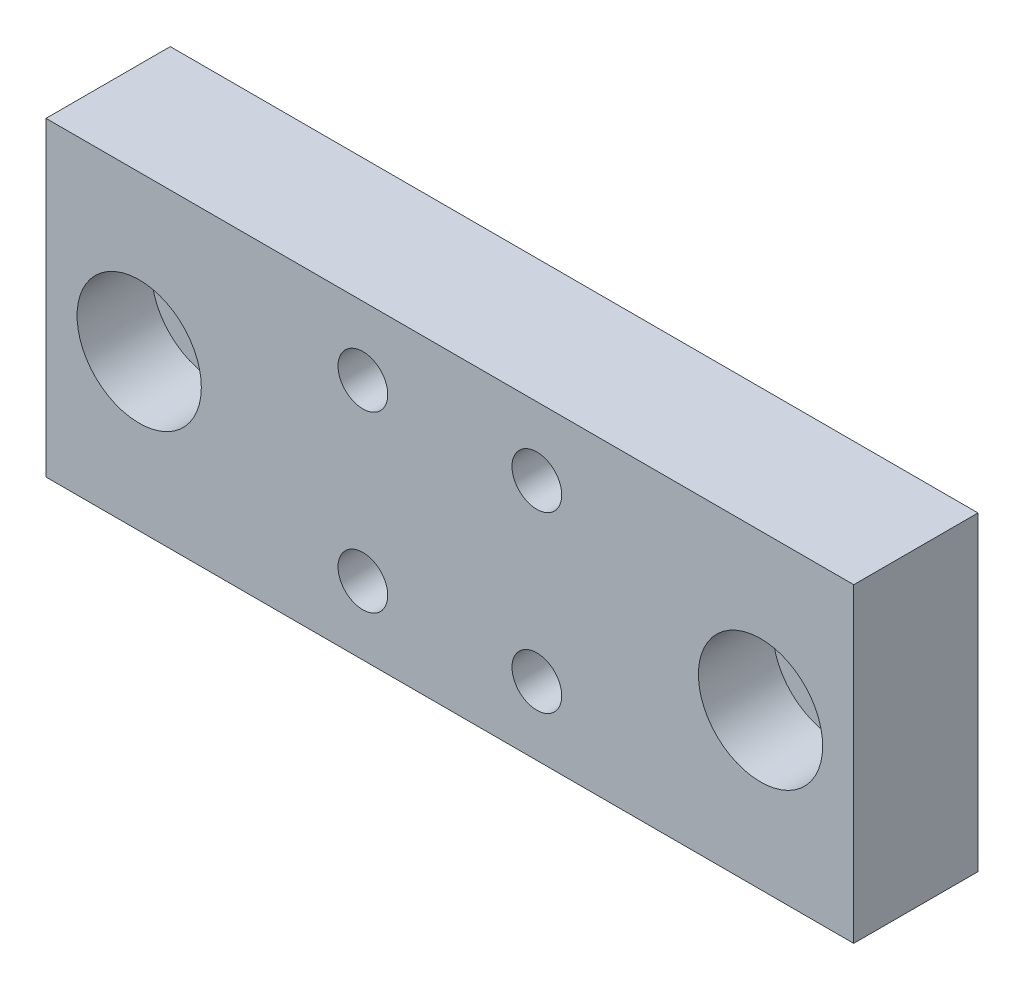
ISO-10303-21;
HEADER;
FILE_DESCRIPTION(('STEP AP214'),'2;1');
FILE_NAME('part.step','',(''),(''),'','','');
FILE_SCHEMA(('AUTOMOTIVE_DESIGN { 1 0 10303 214 1 1 1 1 }'));
ENDSEC;
DATA;
#1=APPLICATION_CONTEXT('core data for automotive mechanical design processes');
#2=APPLICATION_PROTOCOL_DEFINITION('international standard','automotive_design',2000,#1);
#3=PRODUCT_CONTEXT('',#1,'mechanical');
#4=PRODUCT('Part','Part','',(#3));
#5=PRODUCT_RELATED_PRODUCT_CATEGORY('part','',(#4));
#6=PRODUCT_DEFINITION_FORMATION('','',#4);
#7=PRODUCT_DEFINITION_CONTEXT('part definition',#1,'design');
#8=PRODUCT_DEFINITION('design','',#6,#7);
#9=PRODUCT_DEFINITION_SHAPE('','',#8);
#10=(LENGTH_UNIT() NAMED_UNIT(*) SI_UNIT(.MILLI.,.METRE.));
#11=(NAMED_UNIT(*) PLANE_ANGLE_UNIT() SI_UNIT($,.RADIAN.));
#12=(NAMED_UNIT(*) SI_UNIT($,.STERADIAN.) SOLID_ANGLE_UNIT());
#13=UNCERTAINTY_MEASURE_WITH_UNIT(LENGTH_MEASURE(1.E-05),#10,'distance_accuracy_value','');
#14=(GEOMETRIC_REPRESENTATION_CONTEXT(3) GLOBAL_UNCERTAINTY_ASSIGNED_CONTEXT((#13)) GLOBAL_UNIT_ASSIGNED_CONTEXT((#10,
#11,#12)) REPRESENTATION_CONTEXT('',''));
#15=CARTESIAN_POINT('',(0.,0.,0.));
#16=DIRECTION('',(0.,0.,1.));
#17=DIRECTION('',(1.,0.,0.));
#18=AXIS2_PLACEMENT_3D('',#15,#16,#17);
#19=CARTESIAN_POINT('',(9.97863247863252,0.,-14.2));
#20=DIRECTION('',(0.,0.,1.));
#21=DIRECTION('',(1.,0.,0.));
#22=AXIS2_PLACEMENT_3D('',#19,#20,#21);
#23=CYLINDRICAL_SURFACE('',#22,3.);
#24=CARTESIAN_POINT('',(9.97863247863252,0.,0.));
#25=DIRECTION('',(0.,0.,-1.));
#26=DIRECTION('',(-1.,0.,0.));
#27=AXIS2_PLACEMENT_3D('',#24,#25,#26);
#28=CIRCLE('',#27,3.);
#29=CARTESIAN_POINT('',(6.97863247863252,0.,0.));
#30=VERTEX_POINT('',#29);
#31=EDGE_CURVE('E143',#30,#30,#28,.T.);
#32=ORIENTED_EDGE('',*,*,#31,.T.);
#33=EDGE_LOOP('',(#32));
#34=FACE_BOUND('',#33,.T.);
#35=CARTESIAN_POINT('',(9.97863247863252,0.,4.));
#36=DIRECTION('',(0.,0.,1.));
#37=DIRECTION('',(1.,0.,0.));
#38=AXIS2_PLACEMENT_3D('',#35,#36,#37);
#39=CIRCLE('',#38,3.);
#40=CARTESIAN_POINT('',(12.9786324786325,0.,4.));
#41=VERTEX_POINT('',#40);
#42=EDGE_CURVE('E51',#41,#41,#39,.F.);
#43=ORIENTED_EDGE('',*,*,#42,.F.);
#44=EDGE_LOOP('',(#43));
#45=FACE_BOUND('',#44,.T.);
#46=ADVANCED_FACE('F47',(#34,#45),#23,.F.);
#47=CARTESIAN_POINT('',(-40.0213675213675,0.,-14.2));
#48=DIRECTION('',(0.,0.,1.));
#49=DIRECTION('',(1.,0.,0.));
#50=AXIS2_PLACEMENT_3D('',#47,#48,#49);
#51=CYLINDRICAL_SURFACE('',#50,3.);
#52=CARTESIAN_POINT('',(-40.0213675213675,0.,0.));
#53=DIRECTION('',(0.,0.,-1.));
#54=DIRECTION('',(-1.,0.,0.));
#55=AXIS2_PLACEMENT_3D('',#52,#53,#54);
#56=CIRCLE('',#55,3.);
#57=CARTESIAN_POINT('',(-43.0213675213675,0.,0.));
#58=VERTEX_POINT('',#57);
#59=EDGE_CURVE('E139',#58,#58,#56,.T.);
#60=ORIENTED_EDGE('',*,*,#59,.T.);
#61=EDGE_LOOP('',(#60));
#62=FACE_BOUND('',#61,.T.);
#63=CARTESIAN_POINT('',(-40.0213675213675,0.,4.));
#64=DIRECTION('',(0.,0.,1.));
#65=DIRECTION('',(1.,0.,0.));
#66=AXIS2_PLACEMENT_3D('',#63,#64,#65);
#67=CIRCLE('',#66,3.);
#68=CARTESIAN_POINT('',(-37.0213675213675,0.,4.));
#69=VERTEX_POINT('',#68);
#70=EDGE_CURVE('E145',#69,#69,#67,.F.);
#71=ORIENTED_EDGE('',*,*,#70,.F.);
#72=EDGE_LOOP('',(#71));
#73=FACE_BOUND('',#72,.T.);
#74=ADVANCED_FACE('F217',(#62,#73),#51,.F.);
#75=CARTESIAN_POINT('',(-22.0213675213675,7.00000000000001,10.));
#76=DIRECTION('',(0.,0.,-1.));
#77=DIRECTION('',(-1.,0.,0.));
#78=AXIS2_PLACEMENT_3D('',#75,#76,#77);
#79=CYLINDRICAL_SURFACE('',#78,2.);
#80=CARTESIAN_POINT('',(-22.0213675213675,7.00000000000001,10.));
#81=DIRECTION('',(0.,0.,-1.));
#82=DIRECTION('',(-1.,0.,0.));
#83=AXIS2_PLACEMENT_3D('',#80,#81,#82);
#84=CIRCLE('',#83,2.);
#85=CARTESIAN_POINT('',(-24.0213675213675,7.00000000000001,10.));
#86=VERTEX_POINT('',#85);
#87=EDGE_CURVE('E126',#86,#86,#84,.T.);
#88=ORIENTED_EDGE('',*,*,#87,.F.);
#89=EDGE_LOOP('',(#88));
#90=FACE_BOUND('',#89,.T.);
#91=CARTESIAN_POINT('',(-22.0213675213675,7.00000000000001,3.7));
#92=DIRECTION('',(0.,0.,-1.));
#93=DIRECTION('',(-1.,0.,0.));
#94=AXIS2_PLACEMENT_3D('',#91,#92,#93);
#95=CIRCLE('',#94,2.);
#96=CARTESIAN_POINT('',(-24.0213675213675,7.00000000000001,3.7));
#97=VERTEX_POINT('',#96);
#98=EDGE_CURVE('E135',#97,#97,#95,.F.);
#99=ORIENTED_EDGE('',*,*,#98,.F.);
#100=EDGE_LOOP('',(#99));
#101=FACE_BOUND('',#100,.T.);
#102=ADVANCED_FACE('F223',(#90,#101),#79,.F.);
#103=CARTESIAN_POINT('',(-8.02136752136748,7.00000000000001,10.));
#104=DIRECTION('',(0.,0.,-1.));
#105=DIRECTION('',(-1.,0.,0.));
#106=AXIS2_PLACEMENT_3D('',#103,#104,#105);
#107=CYLINDRICAL_SURFACE('',#106,2.);
#108=CARTESIAN_POINT('',(-8.02136752136748,7.00000000000001,10.));
#109=DIRECTION('',(0.,0.,-1.));
#110=DIRECTION('',(-1.,0.,0.));
#111=AXIS2_PLACEMENT_3D('',#108,#109,#110);
#112=CIRCLE('',#111,2.);
#113=CARTESIAN_POINT('',(-10.0213675213675,7.00000000000001,10.));
#114=VERTEX_POINT('',#113);
#115=EDGE_CURVE('E184',#114,#114,#112,.T.);
#116=ORIENTED_EDGE('',*,*,#115,.F.);
#117=EDGE_LOOP('',(#116));
#118=FACE_BOUND('',#117,.T.);
#119=CARTESIAN_POINT('',(-8.02136752136748,7.00000000000001,3.7));
#120=DIRECTION('',(0.,0.,-1.));
#121=DIRECTION('',(-1.,0.,0.));
#122=AXIS2_PLACEMENT_3D('',#119,#120,#121);
#123=CIRCLE('',#122,2.);
#124=CARTESIAN_POINT('',(-10.0213675213675,7.00000000000001,3.7));
#125=VERTEX_POINT('',#124);
#126=EDGE_CURVE('E131',#125,#125,#123,.F.);
#127=ORIENTED_EDGE('',*,*,#126,.F.);
#128=EDGE_LOOP('',(#127));
#129=FACE_BOUND('',#128,.T.);
#130=ADVANCED_FACE('F291',(#118,#129),#107,.F.);
#131=CARTESIAN_POINT('',(-8.02136752136748,-6.99999999999999,10.));
#132=DIRECTION('',(0.,0.,-1.));
#133=DIRECTION('',(-1.,0.,0.));
#134=AXIS2_PLACEMENT_3D('',#131,#132,#133);
#135=CYLINDRICAL_SURFACE('',#134,2.);
#136=CARTESIAN_POINT('',(-8.02136752136748,-6.99999999999999,10.));
#137=DIRECTION('',(0.,0.,-1.));
#138=DIRECTION('',(-1.,0.,0.));
#139=AXIS2_PLACEMENT_3D('',#136,#137,#138);
#140=CIRCLE('',#139,2.);
#141=CARTESIAN_POINT('',(-10.0213675213675,-6.99999999999999,10.));
#142=VERTEX_POINT('',#141);
#143=EDGE_CURVE('E181',#142,#142,#140,.T.);
#144=ORIENTED_EDGE('',*,*,#143,.F.);
#145=EDGE_LOOP('',(#144));
#146=FACE_BOUND('',#145,.T.);
#147=CARTESIAN_POINT('',(-8.02136752136748,-6.99999999999999,3.7));
#148=DIRECTION('',(0.,0.,-1.));
#149=DIRECTION('',(-1.,0.,0.));
#150=AXIS2_PLACEMENT_3D('',#147,#148,#149);
#151=CIRCLE('',#150,2.);
#152=CARTESIAN_POINT('',(-10.0213675213675,-6.99999999999999,3.7));
#153=VERTEX_POINT('',#152);
#154=EDGE_CURVE('E128',#153,#153,#151,.F.);
#155=ORIENTED_EDGE('',*,*,#154,.F.);
#156=EDGE_LOOP('',(#155));
#157=FACE_BOUND('',#156,.T.);
#158=ADVANCED_FACE('F196',(#146,#157),#135,.F.);
#159=CARTESIAN_POINT('',(-22.0213675213675,-6.99999999999999,10.));
#160=DIRECTION('',(0.,0.,-1.));
#161=DIRECTION('',(-1.,0.,0.));
#162=AXIS2_PLACEMENT_3D('',#159,#160,#161);
#163=CYLINDRICAL_SURFACE('',#162,2.);
#164=CARTESIAN_POINT('',(-22.0213675213675,-6.99999999999999,10.));
#165=DIRECTION('',(0.,0.,-1.));
#166=DIRECTION('',(-1.,0.,0.));
#167=AXIS2_PLACEMENT_3D('',#164,#165,#166);
#168=CIRCLE('',#167,2.);
#169=CARTESIAN_POINT('',(-24.0213675213675,-6.99999999999999,10.));
#170=VERTEX_POINT('',#169);
#171=EDGE_CURVE('E117',#170,#170,#168,.T.);
#172=ORIENTED_EDGE('',*,*,#171,.F.);
#173=EDGE_LOOP('',(#172));
#174=FACE_BOUND('',#173,.T.);
#175=CARTESIAN_POINT('',(-22.0213675213675,-6.99999999999999,3.7));
#176=DIRECTION('',(0.,0.,-1.));
#177=DIRECTION('',(-1.,0.,0.));
#178=AXIS2_PLACEMENT_3D('',#175,#176,#177);
#179=CIRCLE('',#178,2.);
#180=CARTESIAN_POINT('',(-24.0213675213675,-6.99999999999999,3.7));
#181=VERTEX_POINT('',#180);
#182=EDGE_CURVE('E123',#181,#181,#179,.F.);
#183=ORIENTED_EDGE('',*,*,#182,.F.);
#184=EDGE_LOOP('',(#183));
#185=FACE_BOUND('',#184,.T.);
#186=ADVANCED_FACE('F193',(#174,#185),#163,.F.);
#187=CARTESIAN_POINT('',(17.4786324786325,-12.5,10.));
#188=DIRECTION('',(-1.,0.,0.));
#189=DIRECTION('',(0.,0.,1.));
#190=AXIS2_PLACEMENT_3D('',#187,#188,#189);
#191=PLANE('',#190);
#192=DIRECTION('',(0.,1.,0.));
#193=VECTOR('',#192,1.);
#194=CARTESIAN_POINT('',(17.4786324786325,-12.5,0.));
#195=LINE('',#194,#193);
#196=CARTESIAN_POINT('',(17.4786324786325,-12.5,0.));
#197=VERTEX_POINT('',#196);
#198=CARTESIAN_POINT('',(17.4786324786325,12.5,0.));
#199=VERTEX_POINT('',#198);
#200=EDGE_CURVE('E114',#197,#199,#195,.T.);
#201=ORIENTED_EDGE('',*,*,#200,.T.);
#202=DIRECTION('',(0.,0.,-1.));
#203=VECTOR('',#202,1.);
#204=CARTESIAN_POINT('',(17.4786324786325,12.5,10.));
#205=LINE('',#204,#203);
#206=CARTESIAN_POINT('',(17.4786324786325,12.5,10.));
#207=VERTEX_POINT('',#206);
#208=EDGE_CURVE('E13',#207,#199,#205,.T.);
#209=ORIENTED_EDGE('',*,*,#208,.F.);
#210=DIRECTION('',(0.,1.,0.));
#211=VECTOR('',#210,1.);
#212=CARTESIAN_POINT('',(17.4786324786325,-12.5,10.));
#213=LINE('',#212,#211);
#214=CARTESIAN_POINT('',(17.4786324786325,-12.5,10.));
#215=VERTEX_POINT('',#214);
#216=EDGE_CURVE('E101',#215,#207,#213,.T.);
#217=ORIENTED_EDGE('',*,*,#216,.F.);
#218=DIRECTION('',(0.,0.,-1.));
#219=VECTOR('',#218,1.);
#220=CARTESIAN_POINT('',(17.4786324786325,-12.5,10.));
#221=LINE('',#220,#219);
#222=EDGE_CURVE('E110',#215,#197,#221,.T.);
#223=ORIENTED_EDGE('',*,*,#222,.T.);
#224=EDGE_LOOP('',(#201,#209,#217,#223));
#225=FACE_BOUND('',#224,.T.);
#226=ADVANCED_FACE('F49',(#225),#191,.F.);
#227=CARTESIAN_POINT('',(-47.5213675213675,12.5,10.));
#228=DIRECTION('',(0.,-1.,0.));
#229=DIRECTION('',(0.,0.,-1.));
#230=AXIS2_PLACEMENT_3D('',#227,#228,#229);
#231=PLANE('',#230);
#232=DIRECTION('',(-1.,0.,0.));
#233=VECTOR('',#232,1.);
#234=CARTESIAN_POINT('',(-47.5213675213675,12.5,0.));
#235=LINE('',#234,#233);
#236=CARTESIAN_POINT('',(-47.5213675213675,12.5,0.));
#237=VERTEX_POINT('',#236);
#238=EDGE_CURVE('E105',#199,#237,#235,.T.);
#239=ORIENTED_EDGE('',*,*,#238,.T.);
#240=DIRECTION('',(0.,0.,-1.));
#241=VECTOR('',#240,1.);
#242=CARTESIAN_POINT('',(-47.5213675213675,12.5,10.));
#243=LINE('',#242,#241);
#244=CARTESIAN_POINT('',(-47.5213675213675,12.5,10.));
#245=VERTEX_POINT('',#244);
#246=EDGE_CURVE('E57',#245,#237,#243,.T.);
#247=ORIENTED_EDGE('',*,*,#246,.F.);
#248=DIRECTION('',(-1.,0.,0.));
#249=VECTOR('',#248,1.);
#250=CARTESIAN_POINT('',(-47.5213675213675,12.5,10.));
#251=LINE('',#250,#249);
#252=EDGE_CURVE('E96',#207,#245,#251,.T.);
#253=ORIENTED_EDGE('',*,*,#252,.F.);
#254=ORIENTED_EDGE('',*,*,#208,.T.);
#255=EDGE_LOOP('',(#239,#247,#253,#254));
#256=FACE_BOUND('',#255,.T.);
#257=ADVANCED_FACE('F104',(#256),#231,.F.);
#258=CARTESIAN_POINT('',(-47.5213675213675,-12.5,10.));
#259=DIRECTION('',(1.,0.,0.));
#260=DIRECTION('',(0.,0.,-1.));
#261=AXIS2_PLACEMENT_3D('',#258,#259,#260);
#262=PLANE('',#261);
#263=DIRECTION('',(0.,-1.,0.));
#264=VECTOR('',#263,1.);
#265=CARTESIAN_POINT('',(-47.5213675213675,-12.5,0.));
#266=LINE('',#265,#264);
#267=CARTESIAN_POINT('',(-47.5213675213675,-12.5,0.));
#268=VERTEX_POINT('',#267);
#269=EDGE_CURVE('E83',#237,#268,#266,.T.);
#270=ORIENTED_EDGE('',*,*,#269,.T.);
#271=DIRECTION('',(0.,0.,-1.));
#272=VECTOR('',#271,1.);
#273=CARTESIAN_POINT('',(-47.5213675213675,-12.5,10.));
#274=LINE('',#273,#272);
#275=CARTESIAN_POINT('',(-47.5213675213675,-12.5,10.));
#276=VERTEX_POINT('',#275);
#277=EDGE_CURVE('E106',#276,#268,#274,.T.);
#278=ORIENTED_EDGE('',*,*,#277,.F.);
#279=DIRECTION('',(0.,-1.,0.));
#280=VECTOR('',#279,1.);
#281=CARTESIAN_POINT('',(-47.5213675213675,-12.5,10.));
#282=LINE('',#281,#280);
#283=EDGE_CURVE('E99',#245,#276,#282,.T.);
#284=ORIENTED_EDGE('',*,*,#283,.F.);
#285=ORIENTED_EDGE('',*,*,#246,.T.);
#286=EDGE_LOOP('',(#270,#278,#284,#285));
#287=FACE_BOUND('',#286,.T.);
#288=ADVANCED_FACE('F108',(#287),#262,.F.);
#289=CARTESIAN_POINT('',(-47.5213675213675,-12.5,10.));
#290=DIRECTION('',(0.,1.,0.));
#291=DIRECTION('',(0.,0.,1.));
#292=AXIS2_PLACEMENT_3D('',#289,#290,#291);
#293=PLANE('',#292);
#294=DIRECTION('',(1.,0.,0.));
#295=VECTOR('',#294,1.);
#296=CARTESIAN_POINT('',(-47.5213675213675,-12.5,0.));
#297=LINE('',#296,#295);
#298=EDGE_CURVE('E89',#268,#197,#297,.T.);
#299=ORIENTED_EDGE('',*,*,#298,.T.);
#300=ORIENTED_EDGE('',*,*,#222,.F.);
#301=DIRECTION('',(1.,0.,0.));
#302=VECTOR('',#301,1.);
#303=CARTESIAN_POINT('',(-47.5213675213675,-12.5,10.));
#304=LINE('',#303,#302);
#305=EDGE_CURVE('E66',#276,#215,#304,.T.);
#306=ORIENTED_EDGE('',*,*,#305,.F.);
#307=ORIENTED_EDGE('',*,*,#277,.T.);
#308=EDGE_LOOP('',(#299,#300,#306,#307));
#309=FACE_BOUND('',#308,.T.);
#310=ADVANCED_FACE('F265',(#309),#293,.F.);
#311=CARTESIAN_POINT('',(0.,0.,10.));
#312=DIRECTION('',(0.,0.,-1.));
#313=DIRECTION('',(-1.,0.,0.));
#314=AXIS2_PLACEMENT_3D('',#311,#312,#313);
#315=PLANE('',#314);
#316=CARTESIAN_POINT('',(9.97863247863252,0.,10.));
#317=DIRECTION('',(0.,0.,1.));
#318=DIRECTION('',(1.,0.,0.));
#319=AXIS2_PLACEMENT_3D('',#316,#317,#318);
#320=CIRCLE('',#319,5.);
#321=CARTESIAN_POINT('',(14.9786324786325,0.,10.));
#322=VERTEX_POINT('',#321);
#323=EDGE_CURVE('E158',#322,#322,#320,.T.);
#324=ORIENTED_EDGE('',*,*,#323,.F.);
#325=EDGE_LOOP('',(#324));
#326=FACE_BOUND('',#325,.T.);
#327=CARTESIAN_POINT('',(-40.0213675213675,0.,10.));
#328=DIRECTION('',(0.,0.,1.));
#329=DIRECTION('',(1.,0.,0.));
#330=AXIS2_PLACEMENT_3D('',#327,#328,#329);
#331=CIRCLE('',#330,5.);
#332=CARTESIAN_POINT('',(-35.0213675213675,0.,10.));
#333=VERTEX_POINT('',#332);
#334=EDGE_CURVE('E151',#333,#333,#331,.T.);
#335=ORIENTED_EDGE('',*,*,#334,.F.);
#336=EDGE_LOOP('',(#335));
#337=FACE_BOUND('',#336,.T.);
#338=ORIENTED_EDGE('',*,*,#143,.T.);
#339=EDGE_LOOP('',(#338));
#340=FACE_BOUND('',#339,.T.);
#341=ORIENTED_EDGE('',*,*,#115,.T.);
#342=EDGE_LOOP('',(#341));
#343=FACE_BOUND('',#342,.T.);
#344=ORIENTED_EDGE('',*,*,#87,.T.);
#345=EDGE_LOOP('',(#344));
#346=FACE_BOUND('',#345,.T.);
#347=ORIENTED_EDGE('',*,*,#171,.T.);
#348=EDGE_LOOP('',(#347));
#349=FACE_BOUND('',#348,.T.);
#350=ORIENTED_EDGE('',*,*,#216,.T.);
#351=ORIENTED_EDGE('',*,*,#252,.T.);
#352=ORIENTED_EDGE('',*,*,#283,.T.);
#353=ORIENTED_EDGE('',*,*,#305,.T.);
#354=EDGE_LOOP('',(#350,#351,#352,#353));
#355=FACE_BOUND('',#354,.T.);
#356=ADVANCED_FACE('F97',(#326,#337,#340,#343,#346,#349,#355),#315,.F.);
#357=CARTESIAN_POINT('',(0.,0.,0.));
#358=DIRECTION('',(0.,0.,-1.));
#359=DIRECTION('',(-1.,0.,0.));
#360=AXIS2_PLACEMENT_3D('',#357,#358,#359);
#361=PLANE('',#360);
#362=ORIENTED_EDGE('',*,*,#31,.F.);
#363=EDGE_LOOP('',(#362));
#364=FACE_BOUND('',#363,.T.);
#365=ORIENTED_EDGE('',*,*,#59,.F.);
#366=EDGE_LOOP('',(#365));
#367=FACE_BOUND('',#366,.T.);
#368=CARTESIAN_POINT('',(-8.02136752136748,-6.99999999999999,0.));
#369=DIRECTION('',(0.,0.,-1.));
#370=DIRECTION('',(-1.,0.,0.));
#371=AXIS2_PLACEMENT_3D('',#368,#369,#370);
#372=CIRCLE('',#371,4.1);
#373=CARTESIAN_POINT('',(-12.1213675213675,-6.99999999999999,0.));
#374=VERTEX_POINT('',#373);
#375=EDGE_CURVE('E163',#374,#374,#372,.T.);
#376=ORIENTED_EDGE('',*,*,#375,.F.);
#377=EDGE_LOOP('',(#376));
#378=FACE_BOUND('',#377,.T.);
#379=CARTESIAN_POINT('',(-8.02136752136748,7.00000000000001,0.));
#380=DIRECTION('',(0.,0.,-1.));
#381=DIRECTION('',(-1.,0.,0.));
#382=AXIS2_PLACEMENT_3D('',#379,#380,#381);
#383=CIRCLE('',#382,4.1);
#384=CARTESIAN_POINT('',(-12.1213675213675,7.00000000000001,0.));
#385=VERTEX_POINT('',#384);
#386=EDGE_CURVE('E169',#385,#385,#383,.T.);
#387=ORIENTED_EDGE('',*,*,#386,.F.);
#388=EDGE_LOOP('',(#387));
#389=FACE_BOUND('',#388,.T.);
#390=CARTESIAN_POINT('',(-22.0213675213675,7.00000000000001,0.));
#391=DIRECTION('',(0.,0.,-1.));
#392=DIRECTION('',(-1.,0.,0.));
#393=AXIS2_PLACEMENT_3D('',#390,#391,#392);
#394=CIRCLE('',#393,4.1);
#395=CARTESIAN_POINT('',(-26.1213675213675,7.00000000000001,0.));
#396=VERTEX_POINT('',#395);
#397=EDGE_CURVE('E142',#396,#396,#394,.T.);
#398=ORIENTED_EDGE('',*,*,#397,.F.);
#399=EDGE_LOOP('',(#398));
#400=FACE_BOUND('',#399,.T.);
#401=CARTESIAN_POINT('',(-22.0213675213675,-6.99999999999999,0.));
#402=DIRECTION('',(0.,0.,-1.));
#403=DIRECTION('',(-1.,0.,0.));
#404=AXIS2_PLACEMENT_3D('',#401,#402,#403);
#405=CIRCLE('',#404,4.1);
#406=CARTESIAN_POINT('',(-26.1213675213675,-6.99999999999999,0.));
#407=VERTEX_POINT('',#406);
#408=EDGE_CURVE('E138',#407,#407,#405,.T.);
#409=ORIENTED_EDGE('',*,*,#408,.F.);
#410=EDGE_LOOP('',(#409));
#411=FACE_BOUND('',#410,.T.);
#412=ORIENTED_EDGE('',*,*,#200,.F.);
#413=ORIENTED_EDGE('',*,*,#298,.F.);
#414=ORIENTED_EDGE('',*,*,#269,.F.);
#415=ORIENTED_EDGE('',*,*,#238,.F.);
#416=EDGE_LOOP('',(#412,#413,#414,#415));
#417=FACE_BOUND('',#416,.T.);
#418=ADVANCED_FACE('F203',(#364,#367,#378,#389,#400,#411,#417),#361,.T.);
#419=CARTESIAN_POINT('',(-22.0213675213675,-6.99999999999999,3.7));
#420=DIRECTION('',(0.,0.,-1.));
#421=DIRECTION('',(-1.,0.,0.));
#422=AXIS2_PLACEMENT_3D('',#419,#420,#421);
#423=PLANE('',#422);
#424=CARTESIAN_POINT('',(-22.0213675213675,-6.99999999999999,3.7));
#425=DIRECTION('',(0.,0.,-1.));
#426=DIRECTION('',(-1.,0.,0.));
#427=AXIS2_PLACEMENT_3D('',#424,#425,#426);
#428=CIRCLE('',#427,4.1);
#429=CARTESIAN_POINT('',(-26.1213675213675,-6.99999999999999,3.7));
#430=VERTEX_POINT('',#429);
#431=EDGE_CURVE('E127',#430,#430,#428,.T.);
#432=ORIENTED_EDGE('',*,*,#431,.T.);
#433=EDGE_LOOP('',(#432));
#434=FACE_BOUND('',#433,.T.);
#435=ORIENTED_EDGE('',*,*,#182,.T.);
#436=EDGE_LOOP('',(#435));
#437=FACE_BOUND('',#436,.T.);
#438=ADVANCED_FACE('F200',(#434,#437),#423,.T.);
#439=CARTESIAN_POINT('',(-22.0213675213675,-6.99999999999999,3.7));
#440=DIRECTION('',(0.,0.,-1.));
#441=DIRECTION('',(-1.,0.,0.));
#442=AXIS2_PLACEMENT_3D('',#439,#440,#441);
#443=CYLINDRICAL_SURFACE('',#442,4.1);
#444=ORIENTED_EDGE('',*,*,#431,.F.);
#445=EDGE_LOOP('',(#444));
#446=FACE_BOUND('',#445,.T.);
#447=ORIENTED_EDGE('',*,*,#408,.T.);
#448=EDGE_LOOP('',(#447));
#449=FACE_BOUND('',#448,.T.);
#450=ADVANCED_FACE('F202',(#446,#449),#443,.F.);
#451=CARTESIAN_POINT('',(-8.02136752136748,-6.99999999999999,3.7));
#452=DIRECTION('',(0.,0.,-1.));
#453=DIRECTION('',(-1.,0.,0.));
#454=AXIS2_PLACEMENT_3D('',#451,#452,#453);
#455=PLANE('',#454);
#456=CARTESIAN_POINT('',(-8.02136752136748,-6.99999999999999,3.7));
#457=DIRECTION('',(0.,0.,-1.));
#458=DIRECTION('',(-1.,0.,0.));
#459=AXIS2_PLACEMENT_3D('',#456,#457,#458);
#460=CIRCLE('',#459,4.1);
#461=CARTESIAN_POINT('',(-12.1213675213675,-6.99999999999999,3.7));
#462=VERTEX_POINT('',#461);
#463=EDGE_CURVE('E132',#462,#462,#460,.T.);
#464=ORIENTED_EDGE('',*,*,#463,.T.);
#465=EDGE_LOOP('',(#464));
#466=FACE_BOUND('',#465,.T.);
#467=ORIENTED_EDGE('',*,*,#154,.T.);
#468=EDGE_LOOP('',(#467));
#469=FACE_BOUND('',#468,.T.);
#470=ADVANCED_FACE('F210',(#466,#469),#455,.T.);
#471=CARTESIAN_POINT('',(-8.02136752136748,-6.99999999999999,3.7));
#472=DIRECTION('',(0.,0.,-1.));
#473=DIRECTION('',(-1.,0.,0.));
#474=AXIS2_PLACEMENT_3D('',#471,#472,#473);
#475=CYLINDRICAL_SURFACE('',#474,4.1);
#476=ORIENTED_EDGE('',*,*,#463,.F.);
#477=EDGE_LOOP('',(#476));
#478=FACE_BOUND('',#477,.T.);
#479=ORIENTED_EDGE('',*,*,#375,.T.);
#480=EDGE_LOOP('',(#479));
#481=FACE_BOUND('',#480,.T.);
#482=ADVANCED_FACE('F233',(#478,#481),#475,.F.);
#483=CARTESIAN_POINT('',(-8.02136752136748,7.00000000000001,3.7));
#484=DIRECTION('',(0.,0.,-1.));
#485=DIRECTION('',(-1.,0.,0.));
#486=AXIS2_PLACEMENT_3D('',#483,#484,#485);
#487=PLANE('',#486);
#488=CARTESIAN_POINT('',(-8.02136752136748,7.00000000000001,3.7));
#489=DIRECTION('',(0.,0.,-1.));
#490=DIRECTION('',(-1.,0.,0.));
#491=AXIS2_PLACEMENT_3D('',#488,#489,#490);
#492=CIRCLE('',#491,4.1);
#493=CARTESIAN_POINT('',(-12.1213675213675,7.00000000000001,3.7));
#494=VERTEX_POINT('',#493);
#495=EDGE_CURVE('E166',#494,#494,#492,.T.);
#496=ORIENTED_EDGE('',*,*,#495,.T.);
#497=EDGE_LOOP('',(#496));
#498=FACE_BOUND('',#497,.T.);
#499=ORIENTED_EDGE('',*,*,#126,.T.);
#500=EDGE_LOOP('',(#499));
#501=FACE_BOUND('',#500,.T.);
#502=ADVANCED_FACE('F237',(#498,#501),#487,.T.);
#503=CARTESIAN_POINT('',(-8.02136752136748,7.00000000000001,3.7));
#504=DIRECTION('',(0.,0.,-1.));
#505=DIRECTION('',(-1.,0.,0.));
#506=AXIS2_PLACEMENT_3D('',#503,#504,#505);
#507=CYLINDRICAL_SURFACE('',#506,4.1);
#508=ORIENTED_EDGE('',*,*,#495,.F.);
#509=EDGE_LOOP('',(#508));
#510=FACE_BOUND('',#509,.T.);
#511=ORIENTED_EDGE('',*,*,#386,.T.);
#512=EDGE_LOOP('',(#511));
#513=FACE_BOUND('',#512,.T.);
#514=ADVANCED_FACE('F241',(#510,#513),#507,.F.);
#515=CARTESIAN_POINT('',(-22.0213675213675,7.00000000000001,3.7));
#516=DIRECTION('',(0.,0.,-1.));
#517=DIRECTION('',(-1.,0.,0.));
#518=AXIS2_PLACEMENT_3D('',#515,#516,#517);
#519=PLANE('',#518);
#520=CARTESIAN_POINT('',(-22.0213675213675,7.00000000000001,3.7));
#521=DIRECTION('',(0.,0.,-1.));
#522=DIRECTION('',(-1.,0.,0.));
#523=AXIS2_PLACEMENT_3D('',#520,#521,#522);
#524=CIRCLE('',#523,4.1);
#525=CARTESIAN_POINT('',(-26.1213675213675,7.00000000000001,3.7));
#526=VERTEX_POINT('',#525);
#527=EDGE_CURVE('E172',#526,#526,#524,.T.);
#528=ORIENTED_EDGE('',*,*,#527,.T.);
#529=EDGE_LOOP('',(#528));
#530=FACE_BOUND('',#529,.T.);
#531=ORIENTED_EDGE('',*,*,#98,.T.);
#532=EDGE_LOOP('',(#531));
#533=FACE_BOUND('',#532,.T.);
#534=ADVANCED_FACE('F245',(#530,#533),#519,.T.);
#535=CARTESIAN_POINT('',(-22.0213675213675,7.00000000000001,3.7));
#536=DIRECTION('',(0.,0.,-1.));
#537=DIRECTION('',(-1.,0.,0.));
#538=AXIS2_PLACEMENT_3D('',#535,#536,#537);
#539=CYLINDRICAL_SURFACE('',#538,4.1);
#540=ORIENTED_EDGE('',*,*,#527,.F.);
#541=EDGE_LOOP('',(#540));
#542=FACE_BOUND('',#541,.T.);
#543=ORIENTED_EDGE('',*,*,#397,.T.);
#544=EDGE_LOOP('',(#543));
#545=FACE_BOUND('',#544,.T.);
#546=ADVANCED_FACE('F248',(#542,#545),#539,.F.);
#547=CARTESIAN_POINT('',(-40.0213675213675,0.,4.));
#548=DIRECTION('',(0.,0.,1.));
#549=DIRECTION('',(1.,0.,0.));
#550=AXIS2_PLACEMENT_3D('',#547,#548,#549);
#551=PLANE('',#550);
#552=CARTESIAN_POINT('',(-40.0213675213675,0.,4.));
#553=DIRECTION('',(0.,0.,1.));
#554=DIRECTION('',(1.,0.,0.));
#555=AXIS2_PLACEMENT_3D('',#552,#553,#554);
#556=CIRCLE('',#555,5.);
#557=CARTESIAN_POINT('',(-35.0213675213675,0.,4.));
#558=VERTEX_POINT('',#557);
#559=EDGE_CURVE('E147',#558,#558,#556,.T.);
#560=ORIENTED_EDGE('',*,*,#559,.T.);
#561=EDGE_LOOP('',(#560));
#562=FACE_BOUND('',#561,.T.);
#563=ORIENTED_EDGE('',*,*,#70,.T.);
#564=EDGE_LOOP('',(#563));
#565=FACE_BOUND('',#564,.T.);
#566=ADVANCED_FACE('F251',(#562,#565),#551,.T.);
#567=CARTESIAN_POINT('',(-40.0213675213675,0.,4.));
#568=DIRECTION('',(0.,0.,1.));
#569=DIRECTION('',(1.,0.,0.));
#570=AXIS2_PLACEMENT_3D('',#567,#568,#569);
#571=CYLINDRICAL_SURFACE('',#570,5.);
#572=ORIENTED_EDGE('',*,*,#559,.F.);
#573=EDGE_LOOP('',(#572));
#574=FACE_BOUND('',#573,.T.);
#575=ORIENTED_EDGE('',*,*,#334,.T.);
#576=EDGE_LOOP('',(#575));
#577=FACE_BOUND('',#576,.T.);
#578=ADVANCED_FACE('F228',(#574,#577),#571,.F.);
#579=CARTESIAN_POINT('',(9.97863247863252,0.,4.));
#580=DIRECTION('',(0.,0.,1.));
#581=DIRECTION('',(1.,0.,0.));
#582=AXIS2_PLACEMENT_3D('',#579,#580,#581);
#583=PLANE('',#582);
#584=CARTESIAN_POINT('',(9.97863247863252,0.,4.));
#585=DIRECTION('',(0.,0.,1.));
#586=DIRECTION('',(1.,0.,0.));
#587=AXIS2_PLACEMENT_3D('',#584,#585,#586);
#588=CIRCLE('',#587,5.);
#589=CARTESIAN_POINT('',(14.9786324786325,0.,4.));
#590=VERTEX_POINT('',#589);
#591=EDGE_CURVE('E364',#590,#590,#588,.T.);
#592=ORIENTED_EDGE('',*,*,#591,.T.);
#593=EDGE_LOOP('',(#592));
#594=FACE_BOUND('',#593,.T.);
#595=ORIENTED_EDGE('',*,*,#42,.T.);
#596=EDGE_LOOP('',(#595));
#597=FACE_BOUND('',#596,.T.);
#598=ADVANCED_FACE('F338',(#594,#597),#583,.T.);
#599=CARTESIAN_POINT('',(9.97863247863252,0.,4.));
#600=DIRECTION('',(0.,0.,1.));
#601=DIRECTION('',(1.,0.,0.));
#602=AXIS2_PLACEMENT_3D('',#599,#600,#601);
#603=CYLINDRICAL_SURFACE('',#602,5.);
#604=ORIENTED_EDGE('',*,*,#591,.F.);
#605=EDGE_LOOP('',(#604));
#606=FACE_BOUND('',#605,.T.);
#607=ORIENTED_EDGE('',*,*,#323,.T.);
#608=EDGE_LOOP('',(#607));
#609=FACE_BOUND('',#608,.T.);
#610=ADVANCED_FACE('F347',(#606,#609),#603,.F.);
#611=CLOSED_SHELL('',(#46,#74,#102,#130,#158,#186,#226,#257,#288,#310,#356,#418,#438,#450,#470,
#482,#502,#514,#534,#546,#566,#578,#598,#610));
#612=MANIFOLD_SOLID_BREP('B2',#611);
#613=ADVANCED_BREP_SHAPE_REPRESENTATION('',(#18,#612),#14);
#614=SHAPE_DEFINITION_REPRESENTATION(#9,#613);
ENDSEC;
END-ISO-10303-21;
